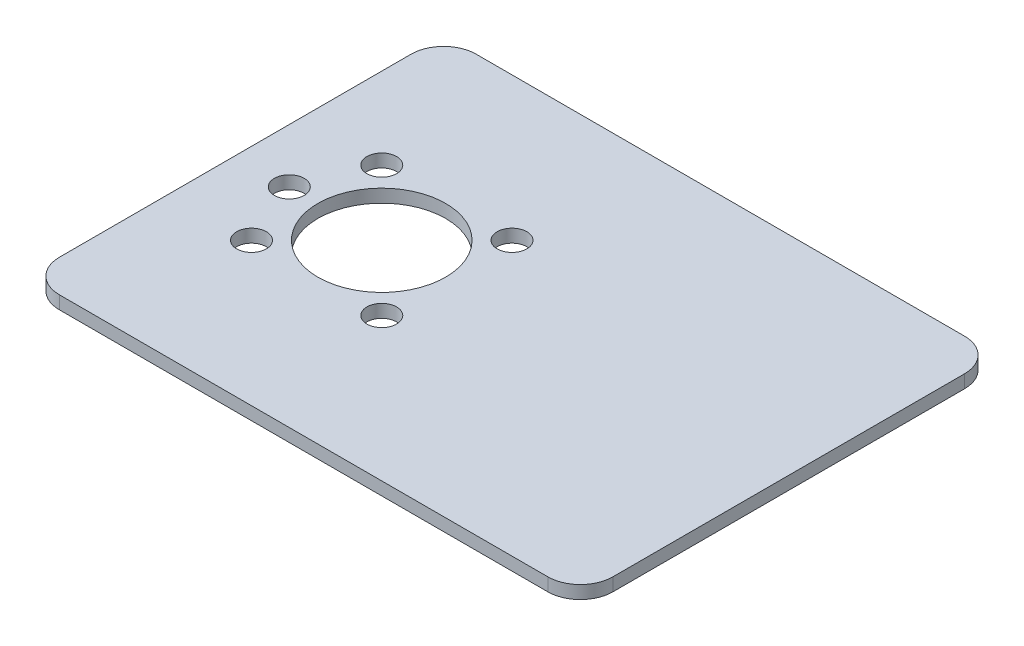
ISO-10303-21;
HEADER;
FILE_DESCRIPTION(('STEP AP214'),'2;1');
FILE_NAME('part.step','',(''),(''),'','','');
FILE_SCHEMA(('AUTOMOTIVE_DESIGN { 1 0 10303 214 1 1 1 1 }'));
ENDSEC;
DATA;
#1=APPLICATION_CONTEXT('core data for automotive mechanical design processes');
#2=APPLICATION_PROTOCOL_DEFINITION('international standard','automotive_design',2000,#1);
#3=PRODUCT_CONTEXT('',#1,'mechanical');
#4=PRODUCT('Part','Part','',(#3));
#5=PRODUCT_RELATED_PRODUCT_CATEGORY('part','',(#4));
#6=PRODUCT_DEFINITION_FORMATION('','',#4);
#7=PRODUCT_DEFINITION_CONTEXT('part definition',#1,'design');
#8=PRODUCT_DEFINITION('design','',#6,#7);
#9=PRODUCT_DEFINITION_SHAPE('','',#8);
#10=(LENGTH_UNIT() NAMED_UNIT(*) SI_UNIT(.MILLI.,.METRE.));
#11=(NAMED_UNIT(*) PLANE_ANGLE_UNIT() SI_UNIT($,.RADIAN.));
#12=(NAMED_UNIT(*) SI_UNIT($,.STERADIAN.) SOLID_ANGLE_UNIT());
#13=UNCERTAINTY_MEASURE_WITH_UNIT(LENGTH_MEASURE(1.E-05),#10,'distance_accuracy_value','');
#14=(GEOMETRIC_REPRESENTATION_CONTEXT(3) GLOBAL_UNCERTAINTY_ASSIGNED_CONTEXT((#13)) GLOBAL_UNIT_ASSIGNED_CONTEXT((#10,
#11,#12)) REPRESENTATION_CONTEXT('',''));
#15=CARTESIAN_POINT('',(0.,0.,0.));
#16=DIRECTION('',(0.,0.,1.));
#17=DIRECTION('',(1.,0.,0.));
#18=AXIS2_PLACEMENT_3D('',#15,#16,#17);
#19=CARTESIAN_POINT('',(0.,2.54,0.));
#20=DIRECTION('',(0.,-1.,0.));
#21=DIRECTION('',(0.,0.,-1.));
#22=AXIS2_PLACEMENT_3D('',#19,#20,#21);
#23=PLANE('',#22);
#24=CARTESIAN_POINT('',(15.875,2.54,-53.34));
#25=DIRECTION('',(0.,1.,0.));
#26=DIRECTION('',(0.,0.,1.));
#27=AXIS2_PLACEMENT_3D('',#24,#25,#26);
#28=CIRCLE('',#27,2.9);
#29=CARTESIAN_POINT('',(15.875,2.54,-50.44));
#30=VERTEX_POINT('',#29);
#31=EDGE_CURVE('E207',#30,#30,#28,.T.);
#32=ORIENTED_EDGE('',*,*,#31,.F.);
#33=EDGE_LOOP('',(#32));
#34=FACE_BOUND('',#33,.T.);
#35=CARTESIAN_POINT('',(41.275,2.54,-53.34));
#36=DIRECTION('',(0.,1.,0.));
#37=DIRECTION('',(0.,0.,1.));
#38=AXIS2_PLACEMENT_3D('',#35,#36,#37);
#39=CIRCLE('',#38,2.9);
#40=CARTESIAN_POINT('',(41.275,2.54,-50.44));
#41=VERTEX_POINT('',#40);
#42=EDGE_CURVE('E201',#41,#41,#39,.T.);
#43=ORIENTED_EDGE('',*,*,#42,.F.);
#44=EDGE_LOOP('',(#43));
#45=FACE_BOUND('',#44,.T.);
#46=CARTESIAN_POINT('',(41.275,2.54,-27.94));
#47=DIRECTION('',(0.,1.,0.));
#48=DIRECTION('',(0.,0.,1.));
#49=AXIS2_PLACEMENT_3D('',#46,#47,#48);
#50=CIRCLE('',#49,2.9);
#51=CARTESIAN_POINT('',(41.275,2.54,-25.04));
#52=VERTEX_POINT('',#51);
#53=EDGE_CURVE('E195',#52,#52,#50,.T.);
#54=ORIENTED_EDGE('',*,*,#53,.F.);
#55=EDGE_LOOP('',(#54));
#56=FACE_BOUND('',#55,.T.);
#57=DIRECTION('',(0.,0.,1.));
#58=VECTOR('',#57,1.);
#59=CARTESIAN_POINT('',(0.,2.54,0.));
#60=LINE('',#59,#58);
#61=CARTESIAN_POINT('',(0.,2.54,-74.93));
#62=VERTEX_POINT('',#61);
#63=CARTESIAN_POINT('',(0.,2.54,-6.35));
#64=VERTEX_POINT('',#63);
#65=EDGE_CURVE('E141',#62,#64,#60,.T.);
#66=ORIENTED_EDGE('',*,*,#65,.T.);
#67=CARTESIAN_POINT('',(6.35,2.54,-6.35));
#68=DIRECTION('',(0.,-1.,0.));
#69=DIRECTION('',(0.,0.,-1.));
#70=AXIS2_PLACEMENT_3D('',#67,#68,#69);
#71=CIRCLE('',#70,6.35);
#72=CARTESIAN_POINT('',(6.35,2.54,0.));
#73=VERTEX_POINT('',#72);
#74=EDGE_CURVE('E156',#64,#73,#71,.F.);
#75=ORIENTED_EDGE('',*,*,#74,.T.);
#76=DIRECTION('',(1.,0.,0.));
#77=VECTOR('',#76,1.);
#78=CARTESIAN_POINT('',(0.,2.54,0.));
#79=LINE('',#78,#77);
#80=CARTESIAN_POINT('',(101.6,2.54,0.));
#81=VERTEX_POINT('',#80);
#82=EDGE_CURVE('E124',#73,#81,#79,.T.);
#83=ORIENTED_EDGE('',*,*,#82,.T.);
#84=CARTESIAN_POINT('',(101.6,2.54,-6.35));
#85=DIRECTION('',(0.,-1.,0.));
#86=DIRECTION('',(0.,0.,-1.));
#87=AXIS2_PLACEMENT_3D('',#84,#85,#86);
#88=CIRCLE('',#87,6.35);
#89=CARTESIAN_POINT('',(107.95,2.54,-6.35));
#90=VERTEX_POINT('',#89);
#91=EDGE_CURVE('E154',#81,#90,#88,.F.);
#92=ORIENTED_EDGE('',*,*,#91,.T.);
#93=DIRECTION('',(0.,0.,-1.));
#94=VECTOR('',#93,1.);
#95=CARTESIAN_POINT('',(107.95,2.54,0.));
#96=LINE('',#95,#94);
#97=CARTESIAN_POINT('',(107.95,2.54,-74.93));
#98=VERTEX_POINT('',#97);
#99=EDGE_CURVE('E167',#90,#98,#96,.T.);
#100=ORIENTED_EDGE('',*,*,#99,.T.);
#101=CARTESIAN_POINT('',(101.6,2.54,-74.93));
#102=DIRECTION('',(0.,-1.,0.));
#103=DIRECTION('',(0.,0.,-1.));
#104=AXIS2_PLACEMENT_3D('',#101,#102,#103);
#105=CIRCLE('',#104,6.35);
#106=CARTESIAN_POINT('',(101.6,2.54,-81.28));
#107=VERTEX_POINT('',#106);
#108=EDGE_CURVE('E59',#98,#107,#105,.F.);
#109=ORIENTED_EDGE('',*,*,#108,.T.);
#110=DIRECTION('',(-1.,0.,0.));
#111=VECTOR('',#110,1.);
#112=CARTESIAN_POINT('',(0.,2.54,-81.28));
#113=LINE('',#112,#111);
#114=CARTESIAN_POINT('',(6.35,2.54,-81.28));
#115=VERTEX_POINT('',#114);
#116=EDGE_CURVE('E142',#107,#115,#113,.T.);
#117=ORIENTED_EDGE('',*,*,#116,.T.);
#118=CARTESIAN_POINT('',(6.35,2.54,-74.93));
#119=DIRECTION('',(0.,-1.,0.));
#120=DIRECTION('',(0.,0.,-1.));
#121=AXIS2_PLACEMENT_3D('',#118,#119,#120);
#122=CIRCLE('',#121,6.35);
#123=EDGE_CURVE('E151',#115,#62,#122,.F.);
#124=ORIENTED_EDGE('',*,*,#123,.T.);
#125=EDGE_LOOP('',(#66,#75,#83,#92,#100,#109,#117,#124));
#126=FACE_BOUND('',#125,.T.);
#127=CARTESIAN_POINT('',(10.541,2.54,-40.64));
#128=DIRECTION('',(0.,1.,0.));
#129=DIRECTION('',(0.,0.,1.));
#130=AXIS2_PLACEMENT_3D('',#127,#128,#129);
#131=CIRCLE('',#130,2.9);
#132=CARTESIAN_POINT('',(10.541,2.54,-37.74));
#133=VERTEX_POINT('',#132);
#134=EDGE_CURVE('E183',#133,#133,#131,.T.);
#135=ORIENTED_EDGE('',*,*,#134,.F.);
#136=EDGE_LOOP('',(#135));
#137=FACE_BOUND('',#136,.T.);
#138=CARTESIAN_POINT('',(15.875,2.54,-27.94));
#139=DIRECTION('',(0.,1.,0.));
#140=DIRECTION('',(0.,0.,1.));
#141=AXIS2_PLACEMENT_3D('',#138,#139,#140);
#142=CIRCLE('',#141,2.9);
#143=CARTESIAN_POINT('',(15.875,2.54,-25.04));
#144=VERTEX_POINT('',#143);
#145=EDGE_CURVE('E189',#144,#144,#142,.T.);
#146=ORIENTED_EDGE('',*,*,#145,.F.);
#147=EDGE_LOOP('',(#146));
#148=FACE_BOUND('',#147,.T.);
#149=CARTESIAN_POINT('',(28.575,2.54,-40.64));
#150=DIRECTION('',(0.,1.,0.));
#151=DIRECTION('',(0.,0.,1.));
#152=AXIS2_PLACEMENT_3D('',#149,#150,#151);
#153=CIRCLE('',#152,12.4587);
#154=CARTESIAN_POINT('',(28.575,2.54,-28.1813));
#155=VERTEX_POINT('',#154);
#156=EDGE_CURVE('E213',#155,#155,#153,.T.);
#157=ORIENTED_EDGE('',*,*,#156,.F.);
#158=EDGE_LOOP('',(#157));
#159=FACE_BOUND('',#158,.T.);
#160=ADVANCED_FACE('F38',(#34,#45,#56,#126,#137,#148,#159),#23,.F.);
#161=CARTESIAN_POINT('',(0.,2.54,0.));
#162=DIRECTION('',(1.,0.,0.));
#163=DIRECTION('',(0.,0.,-1.));
#164=AXIS2_PLACEMENT_3D('',#161,#162,#163);
#165=PLANE('',#164);
#166=DIRECTION('',(0.,0.,1.));
#167=VECTOR('',#166,1.);
#168=CARTESIAN_POINT('',(0.,0.,0.));
#169=LINE('',#168,#167);
#170=CARTESIAN_POINT('',(0.,0.,-74.93));
#171=VERTEX_POINT('',#170);
#172=CARTESIAN_POINT('',(0.,0.,-6.35));
#173=VERTEX_POINT('',#172);
#174=EDGE_CURVE('E131',#171,#173,#169,.T.);
#175=ORIENTED_EDGE('',*,*,#174,.T.);
#176=DIRECTION('',(0.,-1.,0.));
#177=VECTOR('',#176,1.);
#178=CARTESIAN_POINT('',(0.,2.54,-6.35));
#179=LINE('',#178,#177);
#180=EDGE_CURVE('E109',#173,#64,#179,.F.);
#181=ORIENTED_EDGE('',*,*,#180,.T.);
#182=ORIENTED_EDGE('',*,*,#65,.F.);
#183=DIRECTION('',(0.,-1.,0.));
#184=VECTOR('',#183,1.);
#185=CARTESIAN_POINT('',(0.,2.54,-74.93));
#186=LINE('',#185,#184);
#187=EDGE_CURVE('E114',#62,#171,#186,.T.);
#188=ORIENTED_EDGE('',*,*,#187,.T.);
#189=EDGE_LOOP('',(#175,#181,#182,#188));
#190=FACE_BOUND('',#189,.T.);
#191=ADVANCED_FACE('F221',(#190),#165,.F.);
#192=CARTESIAN_POINT('',(0.,2.54,0.));
#193=DIRECTION('',(0.,0.,-1.));
#194=DIRECTION('',(-1.,0.,0.));
#195=AXIS2_PLACEMENT_3D('',#192,#193,#194);
#196=PLANE('',#195);
#197=ORIENTED_EDGE('',*,*,#82,.F.);
#198=DIRECTION('',(0.,-1.,0.));
#199=VECTOR('',#198,1.);
#200=CARTESIAN_POINT('',(6.35,2.54,0.));
#201=LINE('',#200,#199);
#202=CARTESIAN_POINT('',(6.35,0.,0.));
#203=VERTEX_POINT('',#202);
#204=EDGE_CURVE('E108',#73,#203,#201,.T.);
#205=ORIENTED_EDGE('',*,*,#204,.T.);
#206=DIRECTION('',(1.,0.,0.));
#207=VECTOR('',#206,1.);
#208=CARTESIAN_POINT('',(0.,0.,0.));
#209=LINE('',#208,#207);
#210=CARTESIAN_POINT('',(101.6,0.,0.));
#211=VERTEX_POINT('',#210);
#212=EDGE_CURVE('E121',#203,#211,#209,.T.);
#213=ORIENTED_EDGE('',*,*,#212,.T.);
#214=DIRECTION('',(0.,-1.,0.));
#215=VECTOR('',#214,1.);
#216=CARTESIAN_POINT('',(101.6,2.54,0.));
#217=LINE('',#216,#215);
#218=EDGE_CURVE('E126',#211,#81,#217,.F.);
#219=ORIENTED_EDGE('',*,*,#218,.T.);
#220=EDGE_LOOP('',(#197,#205,#213,#219));
#221=FACE_BOUND('',#220,.T.);
#222=ADVANCED_FACE('F120',(#221),#196,.F.);
#223=CARTESIAN_POINT('',(107.95,2.54,0.));
#224=DIRECTION('',(-1.,0.,0.));
#225=DIRECTION('',(0.,0.,1.));
#226=AXIS2_PLACEMENT_3D('',#223,#224,#225);
#227=PLANE('',#226);
#228=ORIENTED_EDGE('',*,*,#99,.F.);
#229=DIRECTION('',(0.,-1.,0.));
#230=VECTOR('',#229,1.);
#231=CARTESIAN_POINT('',(107.95,2.54,-6.35));
#232=LINE('',#231,#230);
#233=CARTESIAN_POINT('',(107.95,0.,-6.35));
#234=VERTEX_POINT('',#233);
#235=EDGE_CURVE('E160',#90,#234,#232,.T.);
#236=ORIENTED_EDGE('',*,*,#235,.T.);
#237=DIRECTION('',(0.,0.,-1.));
#238=VECTOR('',#237,1.);
#239=CARTESIAN_POINT('',(107.95,0.,0.));
#240=LINE('',#239,#238);
#241=CARTESIAN_POINT('',(107.95,0.,-74.93));
#242=VERTEX_POINT('',#241);
#243=EDGE_CURVE('E130',#234,#242,#240,.T.);
#244=ORIENTED_EDGE('',*,*,#243,.T.);
#245=DIRECTION('',(0.,-1.,0.));
#246=VECTOR('',#245,1.);
#247=CARTESIAN_POINT('',(107.95,2.54,-74.93));
#248=LINE('',#247,#246);
#249=EDGE_CURVE('E158',#242,#98,#248,.F.);
#250=ORIENTED_EDGE('',*,*,#249,.T.);
#251=EDGE_LOOP('',(#228,#236,#244,#250));
#252=FACE_BOUND('',#251,.T.);
#253=ADVANCED_FACE('F165',(#252),#227,.F.);
#254=CARTESIAN_POINT('',(0.,2.54,-81.28));
#255=DIRECTION('',(0.,0.,1.));
#256=DIRECTION('',(1.,0.,0.));
#257=AXIS2_PLACEMENT_3D('',#254,#255,#256);
#258=PLANE('',#257);
#259=ORIENTED_EDGE('',*,*,#116,.F.);
#260=DIRECTION('',(0.,-1.,0.));
#261=VECTOR('',#260,1.);
#262=CARTESIAN_POINT('',(101.6,2.54,-81.28));
#263=LINE('',#262,#261);
#264=CARTESIAN_POINT('',(101.6,0.,-81.28));
#265=VERTEX_POINT('',#264);
#266=EDGE_CURVE('E11',#107,#265,#263,.T.);
#267=ORIENTED_EDGE('',*,*,#266,.T.);
#268=DIRECTION('',(-1.,0.,0.));
#269=VECTOR('',#268,1.);
#270=CARTESIAN_POINT('',(0.,0.,-81.28));
#271=LINE('',#270,#269);
#272=CARTESIAN_POINT('',(6.35,0.,-81.28));
#273=VERTEX_POINT('',#272);
#274=EDGE_CURVE('E134',#265,#273,#271,.T.);
#275=ORIENTED_EDGE('',*,*,#274,.T.);
#276=DIRECTION('',(0.,-1.,0.));
#277=VECTOR('',#276,1.);
#278=CARTESIAN_POINT('',(6.35,2.54,-81.28));
#279=LINE('',#278,#277);
#280=EDGE_CURVE('E46',#273,#115,#279,.F.);
#281=ORIENTED_EDGE('',*,*,#280,.T.);
#282=EDGE_LOOP('',(#259,#267,#275,#281));
#283=FACE_BOUND('',#282,.T.);
#284=ADVANCED_FACE('F174',(#283),#258,.F.);
#285=CARTESIAN_POINT('',(0.,0.,0.));
#286=DIRECTION('',(0.,-1.,0.));
#287=DIRECTION('',(0.,0.,-1.));
#288=AXIS2_PLACEMENT_3D('',#285,#286,#287);
#289=PLANE('',#288);
#290=CARTESIAN_POINT('',(28.575,0.,-40.64));
#291=DIRECTION('',(0.,-1.,0.));
#292=DIRECTION('',(0.,0.,-1.));
#293=AXIS2_PLACEMENT_3D('',#290,#291,#292);
#294=CIRCLE('',#293,12.4587);
#295=CARTESIAN_POINT('',(28.575,0.,-53.0987));
#296=VERTEX_POINT('',#295);
#297=EDGE_CURVE('E210',#296,#296,#294,.T.);
#298=ORIENTED_EDGE('',*,*,#297,.F.);
#299=EDGE_LOOP('',(#298));
#300=FACE_BOUND('',#299,.T.);
#301=CARTESIAN_POINT('',(15.875,0.,-53.34));
#302=DIRECTION('',(0.,-1.,0.));
#303=DIRECTION('',(0.,0.,-1.));
#304=AXIS2_PLACEMENT_3D('',#301,#302,#303);
#305=CIRCLE('',#304,2.9);
#306=CARTESIAN_POINT('',(15.875,0.,-56.24));
#307=VERTEX_POINT('',#306);
#308=EDGE_CURVE('E204',#307,#307,#305,.T.);
#309=ORIENTED_EDGE('',*,*,#308,.F.);
#310=EDGE_LOOP('',(#309));
#311=FACE_BOUND('',#310,.T.);
#312=CARTESIAN_POINT('',(41.275,0.,-53.34));
#313=DIRECTION('',(0.,-1.,0.));
#314=DIRECTION('',(0.,0.,-1.));
#315=AXIS2_PLACEMENT_3D('',#312,#313,#314);
#316=CIRCLE('',#315,2.9);
#317=CARTESIAN_POINT('',(41.275,0.,-56.24));
#318=VERTEX_POINT('',#317);
#319=EDGE_CURVE('E198',#318,#318,#316,.T.);
#320=ORIENTED_EDGE('',*,*,#319,.F.);
#321=EDGE_LOOP('',(#320));
#322=FACE_BOUND('',#321,.T.);
#323=CARTESIAN_POINT('',(41.275,0.,-27.94));
#324=DIRECTION('',(0.,-1.,0.));
#325=DIRECTION('',(0.,0.,-1.));
#326=AXIS2_PLACEMENT_3D('',#323,#324,#325);
#327=CIRCLE('',#326,2.9);
#328=CARTESIAN_POINT('',(41.275,0.,-30.84));
#329=VERTEX_POINT('',#328);
#330=EDGE_CURVE('E192',#329,#329,#327,.T.);
#331=ORIENTED_EDGE('',*,*,#330,.F.);
#332=EDGE_LOOP('',(#331));
#333=FACE_BOUND('',#332,.T.);
#334=CARTESIAN_POINT('',(15.875,0.,-27.94));
#335=DIRECTION('',(0.,-1.,0.));
#336=DIRECTION('',(0.,0.,-1.));
#337=AXIS2_PLACEMENT_3D('',#334,#335,#336);
#338=CIRCLE('',#337,2.9);
#339=CARTESIAN_POINT('',(15.875,0.,-30.84));
#340=VERTEX_POINT('',#339);
#341=EDGE_CURVE('E186',#340,#340,#338,.T.);
#342=ORIENTED_EDGE('',*,*,#341,.F.);
#343=EDGE_LOOP('',(#342));
#344=FACE_BOUND('',#343,.T.);
#345=CARTESIAN_POINT('',(10.541,0.,-40.64));
#346=DIRECTION('',(0.,-1.,0.));
#347=DIRECTION('',(0.,0.,-1.));
#348=AXIS2_PLACEMENT_3D('',#345,#346,#347);
#349=CIRCLE('',#348,2.9);
#350=CARTESIAN_POINT('',(10.541,0.,-43.54));
#351=VERTEX_POINT('',#350);
#352=EDGE_CURVE('E136',#351,#351,#349,.T.);
#353=ORIENTED_EDGE('',*,*,#352,.F.);
#354=EDGE_LOOP('',(#353));
#355=FACE_BOUND('',#354,.T.);
#356=ORIENTED_EDGE('',*,*,#212,.F.);
#357=CARTESIAN_POINT('',(6.35,0.,-6.35));
#358=DIRECTION('',(0.,-1.,0.));
#359=DIRECTION('',(0.,0.,-1.));
#360=AXIS2_PLACEMENT_3D('',#357,#358,#359);
#361=CIRCLE('',#360,6.35);
#362=EDGE_CURVE('E104',#203,#173,#361,.T.);
#363=ORIENTED_EDGE('',*,*,#362,.T.);
#364=ORIENTED_EDGE('',*,*,#174,.F.);
#365=CARTESIAN_POINT('',(6.35,0.,-74.93));
#366=DIRECTION('',(0.,-1.,0.));
#367=DIRECTION('',(0.,0.,-1.));
#368=AXIS2_PLACEMENT_3D('',#365,#366,#367);
#369=CIRCLE('',#368,6.35);
#370=EDGE_CURVE('E125',#171,#273,#369,.T.);
#371=ORIENTED_EDGE('',*,*,#370,.T.);
#372=ORIENTED_EDGE('',*,*,#274,.F.);
#373=CARTESIAN_POINT('',(101.6,0.,-74.93));
#374=DIRECTION('',(0.,-1.,0.));
#375=DIRECTION('',(0.,0.,-1.));
#376=AXIS2_PLACEMENT_3D('',#373,#374,#375);
#377=CIRCLE('',#376,6.35);
#378=EDGE_CURVE('E145',#265,#242,#377,.T.);
#379=ORIENTED_EDGE('',*,*,#378,.T.);
#380=ORIENTED_EDGE('',*,*,#243,.F.);
#381=CARTESIAN_POINT('',(101.6,0.,-6.35));
#382=DIRECTION('',(0.,-1.,0.));
#383=DIRECTION('',(0.,0.,-1.));
#384=AXIS2_PLACEMENT_3D('',#381,#382,#383);
#385=CIRCLE('',#384,6.35);
#386=EDGE_CURVE('E115',#234,#211,#385,.T.);
#387=ORIENTED_EDGE('',*,*,#386,.T.);
#388=EDGE_LOOP('',(#356,#363,#364,#371,#372,#379,#380,#387));
#389=FACE_BOUND('',#388,.T.);
#390=ADVANCED_FACE('F128',(#300,#311,#322,#333,#344,#355,#389),#289,.T.);
#391=CARTESIAN_POINT('',(10.541,2.54,-40.64));
#392=DIRECTION('',(0.,1.,0.));
#393=DIRECTION('',(0.,0.,1.));
#394=AXIS2_PLACEMENT_3D('',#391,#392,#393);
#395=CYLINDRICAL_SURFACE('',#394,2.9);
#396=ORIENTED_EDGE('',*,*,#134,.T.);
#397=EDGE_LOOP('',(#396));
#398=FACE_BOUND('',#397,.T.);
#399=ORIENTED_EDGE('',*,*,#352,.T.);
#400=EDGE_LOOP('',(#399));
#401=FACE_BOUND('',#400,.T.);
#402=ADVANCED_FACE('F234',(#398,#401),#395,.F.);
#403=CARTESIAN_POINT('',(15.875,2.54,-27.94));
#404=DIRECTION('',(0.,1.,0.));
#405=DIRECTION('',(0.,0.,1.));
#406=AXIS2_PLACEMENT_3D('',#403,#404,#405);
#407=CYLINDRICAL_SURFACE('',#406,2.9);
#408=ORIENTED_EDGE('',*,*,#145,.T.);
#409=EDGE_LOOP('',(#408));
#410=FACE_BOUND('',#409,.T.);
#411=ORIENTED_EDGE('',*,*,#341,.T.);
#412=EDGE_LOOP('',(#411));
#413=FACE_BOUND('',#412,.T.);
#414=ADVANCED_FACE('F263',(#410,#413),#407,.F.);
#415=CARTESIAN_POINT('',(41.275,2.54,-27.94));
#416=DIRECTION('',(0.,1.,0.));
#417=DIRECTION('',(0.,0.,1.));
#418=AXIS2_PLACEMENT_3D('',#415,#416,#417);
#419=CYLINDRICAL_SURFACE('',#418,2.9);
#420=ORIENTED_EDGE('',*,*,#53,.T.);
#421=EDGE_LOOP('',(#420));
#422=FACE_BOUND('',#421,.T.);
#423=ORIENTED_EDGE('',*,*,#330,.T.);
#424=EDGE_LOOP('',(#423));
#425=FACE_BOUND('',#424,.T.);
#426=ADVANCED_FACE('F266',(#422,#425),#419,.F.);
#427=CARTESIAN_POINT('',(41.275,2.54,-53.34));
#428=DIRECTION('',(0.,1.,0.));
#429=DIRECTION('',(0.,0.,1.));
#430=AXIS2_PLACEMENT_3D('',#427,#428,#429);
#431=CYLINDRICAL_SURFACE('',#430,2.9);
#432=ORIENTED_EDGE('',*,*,#42,.T.);
#433=EDGE_LOOP('',(#432));
#434=FACE_BOUND('',#433,.T.);
#435=ORIENTED_EDGE('',*,*,#319,.T.);
#436=EDGE_LOOP('',(#435));
#437=FACE_BOUND('',#436,.T.);
#438=ADVANCED_FACE('F289',(#434,#437),#431,.F.);
#439=CARTESIAN_POINT('',(15.875,2.54,-53.34));
#440=DIRECTION('',(0.,1.,0.));
#441=DIRECTION('',(0.,0.,1.));
#442=AXIS2_PLACEMENT_3D('',#439,#440,#441);
#443=CYLINDRICAL_SURFACE('',#442,2.9);
#444=ORIENTED_EDGE('',*,*,#31,.T.);
#445=EDGE_LOOP('',(#444));
#446=FACE_BOUND('',#445,.T.);
#447=ORIENTED_EDGE('',*,*,#308,.T.);
#448=EDGE_LOOP('',(#447));
#449=FACE_BOUND('',#448,.T.);
#450=ADVANCED_FACE('F298',(#446,#449),#443,.F.);
#451=CARTESIAN_POINT('',(28.575,2.54,-40.64));
#452=DIRECTION('',(0.,1.,0.));
#453=DIRECTION('',(0.,0.,1.));
#454=AXIS2_PLACEMENT_3D('',#451,#452,#453);
#455=CYLINDRICAL_SURFACE('',#454,12.4587);
#456=ORIENTED_EDGE('',*,*,#156,.T.);
#457=EDGE_LOOP('',(#456));
#458=FACE_BOUND('',#457,.T.);
#459=ORIENTED_EDGE('',*,*,#297,.T.);
#460=EDGE_LOOP('',(#459));
#461=FACE_BOUND('',#460,.T.);
#462=ADVANCED_FACE('F217',(#458,#461),#455,.F.);
#463=CARTESIAN_POINT('',(6.35,2.54,-6.35));
#464=DIRECTION('',(0.,-1.,0.));
#465=DIRECTION('',(0.,0.,-1.));
#466=AXIS2_PLACEMENT_3D('',#463,#464,#465);
#467=CYLINDRICAL_SURFACE('',#466,6.35);
#468=ORIENTED_EDGE('',*,*,#74,.F.);
#469=ORIENTED_EDGE('',*,*,#180,.F.);
#470=ORIENTED_EDGE('',*,*,#362,.F.);
#471=ORIENTED_EDGE('',*,*,#204,.F.);
#472=EDGE_LOOP('',(#468,#469,#470,#471));
#473=FACE_BOUND('',#472,.T.);
#474=ADVANCED_FACE('F107',(#473),#467,.T.);
#475=CARTESIAN_POINT('',(101.6,2.54,-6.35));
#476=DIRECTION('',(0.,-1.,0.));
#477=DIRECTION('',(0.,0.,-1.));
#478=AXIS2_PLACEMENT_3D('',#475,#476,#477);
#479=CYLINDRICAL_SURFACE('',#478,6.35);
#480=ORIENTED_EDGE('',*,*,#91,.F.);
#481=ORIENTED_EDGE('',*,*,#218,.F.);
#482=ORIENTED_EDGE('',*,*,#386,.F.);
#483=ORIENTED_EDGE('',*,*,#235,.F.);
#484=EDGE_LOOP('',(#480,#481,#482,#483));
#485=FACE_BOUND('',#484,.T.);
#486=ADVANCED_FACE('F247',(#485),#479,.T.);
#487=CARTESIAN_POINT('',(101.6,2.54,-74.93));
#488=DIRECTION('',(0.,-1.,0.));
#489=DIRECTION('',(0.,0.,-1.));
#490=AXIS2_PLACEMENT_3D('',#487,#488,#489);
#491=CYLINDRICAL_SURFACE('',#490,6.35);
#492=ORIENTED_EDGE('',*,*,#108,.F.);
#493=ORIENTED_EDGE('',*,*,#249,.F.);
#494=ORIENTED_EDGE('',*,*,#378,.F.);
#495=ORIENTED_EDGE('',*,*,#266,.F.);
#496=EDGE_LOOP('',(#492,#493,#494,#495));
#497=FACE_BOUND('',#496,.T.);
#498=ADVANCED_FACE('F173',(#497),#491,.T.);
#499=CARTESIAN_POINT('',(6.35,2.54,-74.93));
#500=DIRECTION('',(0.,-1.,0.));
#501=DIRECTION('',(0.,0.,-1.));
#502=AXIS2_PLACEMENT_3D('',#499,#500,#501);
#503=CYLINDRICAL_SURFACE('',#502,6.35);
#504=ORIENTED_EDGE('',*,*,#123,.F.);
#505=ORIENTED_EDGE('',*,*,#280,.F.);
#506=ORIENTED_EDGE('',*,*,#370,.F.);
#507=ORIENTED_EDGE('',*,*,#187,.F.);
#508=EDGE_LOOP('',(#504,#505,#506,#507));
#509=FACE_BOUND('',#508,.T.);
#510=ADVANCED_FACE('F40',(#509),#503,.T.);
#511=CLOSED_SHELL('',(#160,#191,#222,#253,#284,#390,#402,#414,#426,#438,#450,#462,#474,#486,
#498,#510));
#512=MANIFOLD_SOLID_BREP('B2',#511);
#513=ADVANCED_BREP_SHAPE_REPRESENTATION('',(#18,#512),#14);
#514=SHAPE_DEFINITION_REPRESENTATION(#9,#513);
ENDSEC;
END-ISO-10303-21;
